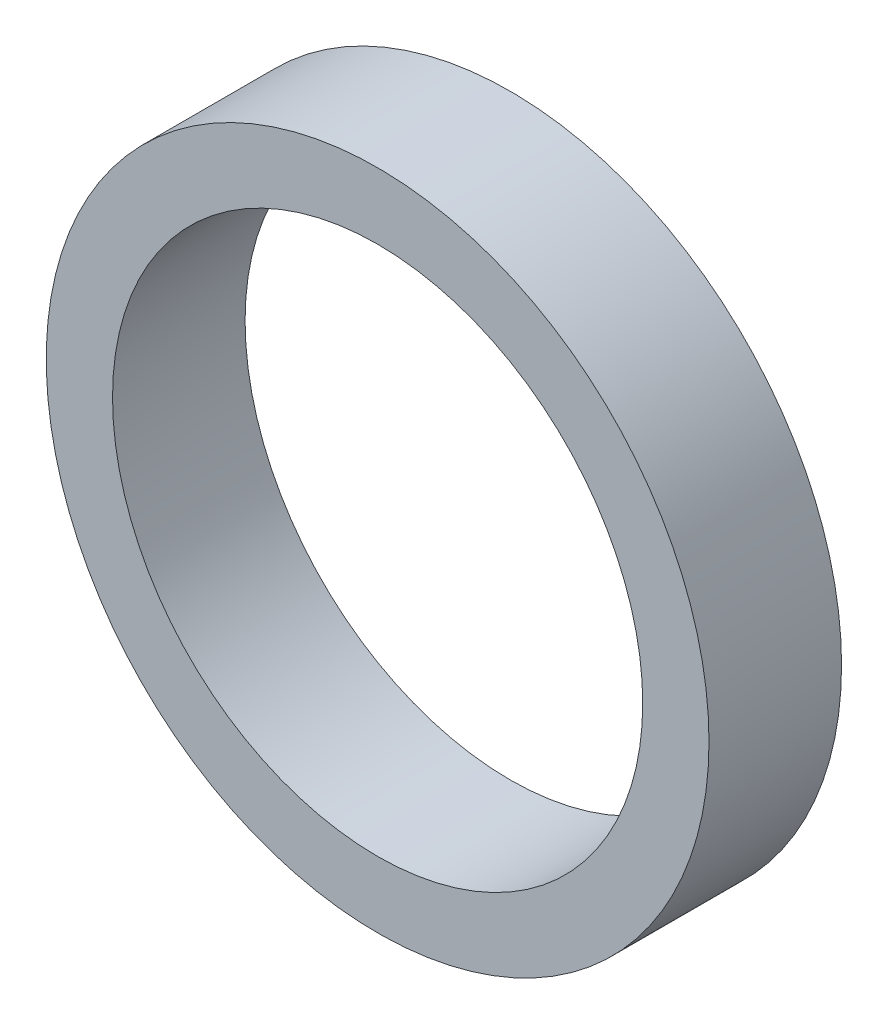
ISO-10303-21;
HEADER;
FILE_DESCRIPTION(('STEP AP214'),'2;1');
FILE_NAME('part.step','',(''),(''),'','','');
FILE_SCHEMA(('AUTOMOTIVE_DESIGN { 1 0 10303 214 1 1 1 1 }'));
ENDSEC;
DATA;
#1=APPLICATION_CONTEXT('core data for automotive mechanical design processes');
#2=APPLICATION_PROTOCOL_DEFINITION('international standard','automotive_design',2000,#1);
#3=PRODUCT_CONTEXT('',#1,'mechanical');
#4=PRODUCT('Part','Part','',(#3));
#5=PRODUCT_RELATED_PRODUCT_CATEGORY('part','',(#4));
#6=PRODUCT_DEFINITION_FORMATION('','',#4);
#7=PRODUCT_DEFINITION_CONTEXT('part definition',#1,'design');
#8=PRODUCT_DEFINITION('design','',#6,#7);
#9=PRODUCT_DEFINITION_SHAPE('','',#8);
#10=(LENGTH_UNIT() NAMED_UNIT(*) SI_UNIT(.MILLI.,.METRE.));
#11=(NAMED_UNIT(*) PLANE_ANGLE_UNIT() SI_UNIT($,.RADIAN.));
#12=(NAMED_UNIT(*) SI_UNIT($,.STERADIAN.) SOLID_ANGLE_UNIT());
#13=UNCERTAINTY_MEASURE_WITH_UNIT(LENGTH_MEASURE(1.E-05),#10,'distance_accuracy_value','');
#14=(GEOMETRIC_REPRESENTATION_CONTEXT(3) GLOBAL_UNCERTAINTY_ASSIGNED_CONTEXT((#13)) GLOBAL_UNIT_ASSIGNED_CONTEXT((#10,
#11,#12)) REPRESENTATION_CONTEXT('',''));
#15=CARTESIAN_POINT('',(0.,0.,0.));
#16=DIRECTION('',(0.,0.,1.));
#17=DIRECTION('',(1.,0.,0.));
#18=AXIS2_PLACEMENT_3D('',#15,#16,#17);
#19=CARTESIAN_POINT('',(0.,0.,12.7));
#20=DIRECTION('',(0.,0.,-1.));
#21=DIRECTION('',(-1.,0.,0.));
#22=AXIS2_PLACEMENT_3D('',#19,#20,#21);
#23=CYLINDRICAL_SURFACE('',#22,31.75);
#24=CARTESIAN_POINT('',(0.,0.,12.7));
#25=DIRECTION('',(0.,0.,1.));
#26=DIRECTION('',(1.,0.,0.));
#27=AXIS2_PLACEMENT_3D('',#24,#25,#26);
#28=CIRCLE('',#27,31.75);
#29=CARTESIAN_POINT('',(31.75,0.,12.7));
#30=VERTEX_POINT('',#29);
#31=EDGE_CURVE('E10',#30,#30,#28,.T.);
#32=ORIENTED_EDGE('',*,*,#31,.F.);
#33=EDGE_LOOP('',(#32));
#34=FACE_BOUND('',#33,.T.);
#35=CARTESIAN_POINT('',(0.,0.,0.));
#36=DIRECTION('',(0.,0.,1.));
#37=DIRECTION('',(1.,0.,0.));
#38=AXIS2_PLACEMENT_3D('',#35,#36,#37);
#39=CIRCLE('',#38,31.75);
#40=CARTESIAN_POINT('',(31.75,0.,0.));
#41=VERTEX_POINT('',#40);
#42=EDGE_CURVE('E46',#41,#41,#39,.T.);
#43=ORIENTED_EDGE('',*,*,#42,.T.);
#44=EDGE_LOOP('',(#43));
#45=FACE_BOUND('',#44,.T.);
#46=ADVANCED_FACE('F43',(#34,#45),#23,.T.);
#47=CARTESIAN_POINT('',(0.,0.,12.7));
#48=DIRECTION('',(0.,0.,1.));
#49=DIRECTION('',(1.,0.,0.));
#50=AXIS2_PLACEMENT_3D('',#47,#48,#49);
#51=PLANE('',#50);
#52=CARTESIAN_POINT('',(0.,0.,12.7));
#53=DIRECTION('',(0.,0.,1.));
#54=DIRECTION('',(1.,0.,0.));
#55=AXIS2_PLACEMENT_3D('',#52,#53,#54);
#56=CIRCLE('',#55,25.4);
#57=CARTESIAN_POINT('',(25.4,0.,12.7));
#58=VERTEX_POINT('',#57);
#59=EDGE_CURVE('E55',#58,#58,#56,.T.);
#60=ORIENTED_EDGE('',*,*,#59,.F.);
#61=EDGE_LOOP('',(#60));
#62=FACE_BOUND('',#61,.T.);
#63=ORIENTED_EDGE('',*,*,#31,.T.);
#64=EDGE_LOOP('',(#63));
#65=FACE_BOUND('',#64,.T.);
#66=ADVANCED_FACE('F70',(#62,#65),#51,.T.);
#67=CARTESIAN_POINT('',(0.,0.,0.));
#68=DIRECTION('',(0.,0.,1.));
#69=DIRECTION('',(1.,0.,0.));
#70=AXIS2_PLACEMENT_3D('',#67,#68,#69);
#71=PLANE('',#70);
#72=CARTESIAN_POINT('',(0.,0.,0.));
#73=DIRECTION('',(0.,0.,1.));
#74=DIRECTION('',(1.,0.,0.));
#75=AXIS2_PLACEMENT_3D('',#72,#73,#74);
#76=CIRCLE('',#75,25.4);
#77=CARTESIAN_POINT('',(25.4,0.,0.));
#78=VERTEX_POINT('',#77);
#79=EDGE_CURVE('E53',#78,#78,#76,.T.);
#80=ORIENTED_EDGE('',*,*,#79,.T.);
#81=EDGE_LOOP('',(#80));
#82=FACE_BOUND('',#81,.T.);
#83=ORIENTED_EDGE('',*,*,#42,.F.);
#84=EDGE_LOOP('',(#83));
#85=FACE_BOUND('',#84,.T.);
#86=ADVANCED_FACE('F61',(#82,#85),#71,.F.);
#87=CARTESIAN_POINT('',(0.,0.,0.));
#88=DIRECTION('',(0.,0.,1.));
#89=DIRECTION('',(1.,0.,0.));
#90=AXIS2_PLACEMENT_3D('',#87,#88,#89);
#91=CYLINDRICAL_SURFACE('',#90,25.4);
#92=ORIENTED_EDGE('',*,*,#79,.F.);
#93=EDGE_LOOP('',(#92));
#94=FACE_BOUND('',#93,.T.);
#95=ORIENTED_EDGE('',*,*,#59,.T.);
#96=EDGE_LOOP('',(#95));
#97=FACE_BOUND('',#96,.T.);
#98=ADVANCED_FACE('F64',(#94,#97),#91,.F.);
#99=CLOSED_SHELL('',(#46,#66,#86,#98));
#100=MANIFOLD_SOLID_BREP('B2',#99);
#101=ADVANCED_BREP_SHAPE_REPRESENTATION('',(#18,#100),#14);
#102=SHAPE_DEFINITION_REPRESENTATION(#9,#101);
ENDSEC;
END-ISO-10303-21;
